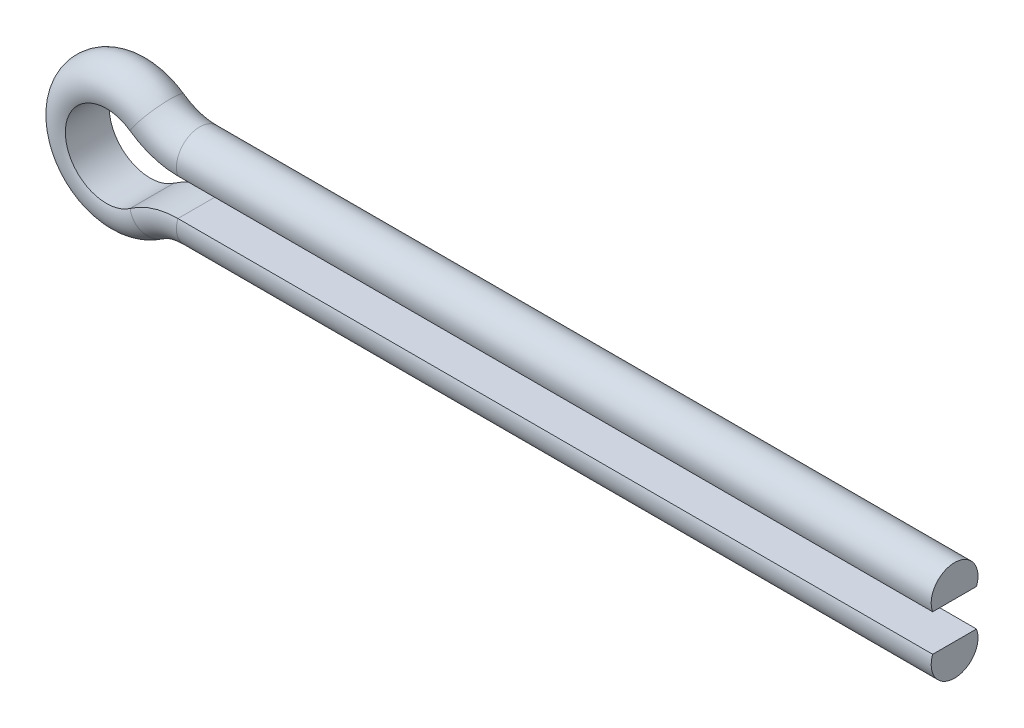
ISO-10303-21;
HEADER;
FILE_DESCRIPTION(('STEP AP214'),'2;1');
FILE_NAME('part.step','',(''),(''),'','','');
FILE_SCHEMA(('AUTOMOTIVE_DESIGN { 1 0 10303 214 1 1 1 1 }'));
ENDSEC;
DATA;
#1=APPLICATION_CONTEXT('core data for automotive mechanical design processes');
#2=APPLICATION_PROTOCOL_DEFINITION('international standard','automotive_design',2000,#1);
#3=PRODUCT_CONTEXT('',#1,'mechanical');
#4=PRODUCT('Part','Part','',(#3));
#5=PRODUCT_RELATED_PRODUCT_CATEGORY('part','',(#4));
#6=PRODUCT_DEFINITION_FORMATION('','',#4);
#7=PRODUCT_DEFINITION_CONTEXT('part definition',#1,'design');
#8=PRODUCT_DEFINITION('design','',#6,#7);
#9=PRODUCT_DEFINITION_SHAPE('','',#8);
#10=(LENGTH_UNIT() NAMED_UNIT(*) SI_UNIT(.MILLI.,.METRE.));
#11=(NAMED_UNIT(*) PLANE_ANGLE_UNIT() SI_UNIT($,.RADIAN.));
#12=(NAMED_UNIT(*) SI_UNIT($,.STERADIAN.) SOLID_ANGLE_UNIT());
#13=UNCERTAINTY_MEASURE_WITH_UNIT(LENGTH_MEASURE(1.E-05),#10,'distance_accuracy_value','');
#14=(GEOMETRIC_REPRESENTATION_CONTEXT(3) GLOBAL_UNCERTAINTY_ASSIGNED_CONTEXT((#13)) GLOBAL_UNIT_ASSIGNED_CONTEXT((#10,
#11,#12)) REPRESENTATION_CONTEXT('',''));
#15=CARTESIAN_POINT('',(0.,0.,0.));
#16=DIRECTION('',(0.,0.,1.));
#17=DIRECTION('',(1.,0.,0.));
#18=AXIS2_PLACEMENT_3D('',#15,#16,#17);
#19=CARTESIAN_POINT('',(100.,-3.22598455954152,0.));
#20=DIRECTION('',(-1.,0.,0.));
#21=DIRECTION('',(0.,-1.,0.));
#22=AXIS2_PLACEMENT_3D('',#19,#20,#21);
#23=PLANE('',#22);
#24=CARTESIAN_POINT('',(100.,-3.22598455954152,0.));
#25=DIRECTION('',(-1.,0.,0.));
#26=DIRECTION('',(0.,-1.,0.));
#27=AXIS2_PLACEMENT_3D('',#24,#25,#26);
#28=CIRCLE('',#27,2.8336817484193);
#29=CARTESIAN_POINT('',(100.,-2.22598455954152,-2.65136799620962));
#30=VERTEX_POINT('',#29);
#31=CARTESIAN_POINT('',(100.,-2.22598455954152,2.65136799620962));
#32=VERTEX_POINT('',#31);
#33=EDGE_CURVE('E79',#30,#32,#28,.T.);
#34=ORIENTED_EDGE('',*,*,#33,.F.);
#35=DIRECTION('',(0.,0.,-1.));
#36=VECTOR('',#35,1.);
#37=CARTESIAN_POINT('',(100.,-2.22598455954152,-2.65136799620962));
#38=LINE('',#37,#36);
#39=EDGE_CURVE('E81',#32,#30,#38,.T.);
#40=ORIENTED_EDGE('',*,*,#39,.F.);
#41=EDGE_LOOP('',(#34,#40));
#42=FACE_BOUND('',#41,.T.);
#43=ADVANCED_FACE('F33',(#42),#23,.F.);
#44=CARTESIAN_POINT('',(100.,3.22598455954152,0.));
#45=DIRECTION('',(1.,0.,0.));
#46=DIRECTION('',(0.,1.,0.));
#47=AXIS2_PLACEMENT_3D('',#44,#45,#46);
#48=PLANE('',#47);
#49=CARTESIAN_POINT('',(100.,3.22598455954152,0.));
#50=DIRECTION('',(1.,0.,0.));
#51=DIRECTION('',(0.,1.,0.));
#52=AXIS2_PLACEMENT_3D('',#49,#50,#51);
#53=CIRCLE('',#52,2.8336817484193);
#54=CARTESIAN_POINT('',(100.,2.22598455954152,-2.65136799620962));
#55=VERTEX_POINT('',#54);
#56=CARTESIAN_POINT('',(100.,2.22598455954152,2.65136799620962));
#57=VERTEX_POINT('',#56);
#58=EDGE_CURVE('E45',#55,#57,#53,.T.);
#59=ORIENTED_EDGE('',*,*,#58,.T.);
#60=DIRECTION('',(0.,0.,-1.));
#61=VECTOR('',#60,1.);
#62=CARTESIAN_POINT('',(100.,2.22598455954152,-2.65136799620962));
#63=LINE('',#62,#61);
#64=EDGE_CURVE('E11',#57,#55,#63,.T.);
#65=ORIENTED_EDGE('',*,*,#64,.T.);
#66=EDGE_LOOP('',(#59,#65));
#67=FACE_BOUND('',#66,.T.);
#68=ADVANCED_FACE('F184',(#67),#48,.T.);
#69=CARTESIAN_POINT('',(100.,-3.22598455954152,0.));
#70=DIRECTION('',(-1.,0.,0.));
#71=DIRECTION('',(0.,-1.,0.));
#72=AXIS2_PLACEMENT_3D('',#69,#70,#71);
#73=CYLINDRICAL_SURFACE('',#72,2.8336817484193);
#74=DIRECTION('',(-1.,0.,0.));
#75=VECTOR('',#74,1.);
#76=CARTESIAN_POINT('',(100.,-2.22598455954152,2.65136799620962));
#77=LINE('',#76,#75);
#78=CARTESIAN_POINT('',(8.65308143228442,-2.22598455954152,2.65136799620962));
#79=VERTEX_POINT('',#78);
#80=EDGE_CURVE('E92',#32,#79,#77,.T.);
#81=ORIENTED_EDGE('',*,*,#80,.T.);
#82=CARTESIAN_POINT('',(8.65308143228442,-3.22598455954152,0.));
#83=DIRECTION('',(-1.,0.,0.));
#84=DIRECTION('',(0.,-1.,0.));
#85=AXIS2_PLACEMENT_3D('',#82,#83,#84);
#86=CIRCLE('',#85,2.8336817484193);
#87=CARTESIAN_POINT('',(8.65308143228442,-2.22598455954153,-2.65136799620962));
#88=VERTEX_POINT('',#87);
#89=EDGE_CURVE('E97',#88,#79,#86,.T.);
#90=ORIENTED_EDGE('',*,*,#89,.F.);
#91=DIRECTION('',(-1.,0.,0.));
#92=VECTOR('',#91,1.);
#93=CARTESIAN_POINT('',(100.,-2.22598455954152,-2.65136799620962));
#94=LINE('',#93,#92);
#95=EDGE_CURVE('E91',#30,#88,#94,.T.);
#96=ORIENTED_EDGE('',*,*,#95,.F.);
#97=ORIENTED_EDGE('',*,*,#33,.T.);
#98=EDGE_LOOP('',(#81,#90,#96,#97));
#99=FACE_BOUND('',#98,.T.);
#100=ADVANCED_FACE('F95',(#99),#73,.T.);
#101=CARTESIAN_POINT('',(100.,-2.22598455954152,-2.65136799620962));
#102=DIRECTION('',(0.,1.,0.));
#103=DIRECTION('',(0.,0.,1.));
#104=AXIS2_PLACEMENT_3D('',#101,#102,#103);
#105=PLANE('',#104);
#106=DIRECTION('',(0.,0.,-1.));
#107=VECTOR('',#106,1.);
#108=CARTESIAN_POINT('',(8.65308143228442,-2.22598455954153,-2.65136799620962));
#109=LINE('',#108,#107);
#110=EDGE_CURVE('E112',#79,#88,#109,.T.);
#111=ORIENTED_EDGE('',*,*,#110,.F.);
#112=ORIENTED_EDGE('',*,*,#80,.F.);
#113=ORIENTED_EDGE('',*,*,#39,.T.);
#114=ORIENTED_EDGE('',*,*,#95,.T.);
#115=EDGE_LOOP('',(#111,#112,#113,#114));
#116=FACE_BOUND('',#115,.T.);
#117=ADVANCED_FACE('F90',(#116),#105,.T.);
#118=CARTESIAN_POINT('',(8.65308143228442,-12.252517362822,0.));
#119=DIRECTION('',(0.,0.,1.));
#120=DIRECTION('',(1.,0.,0.));
#121=AXIS2_PLACEMENT_3D('',#118,#119,#120);
#122=TOROIDAL_SURFACE('',#121,9.02653280328048,2.8336817484193);
#123=CARTESIAN_POINT('',(8.65308143228442,-12.252517362822,2.65136799620962));
#124=DIRECTION('',(0.,0.,1.));
#125=DIRECTION('',(0.,1.,0.));
#126=AXIS2_PLACEMENT_3D('',#123,#124,#125);
#127=CIRCLE('',#126,10.0265328032805);
#128=CARTESIAN_POINT('',(2.86905444360062,-4.06249954541544,2.65136799620962));
#129=VERTEX_POINT('',#128);
#130=EDGE_CURVE('E105',#79,#129,#127,.T.);
#131=ORIENTED_EDGE('',*,*,#130,.T.);
#132=CARTESIAN_POINT('',(3.44592653908625,-4.87933403627024,0.));
#133=DIRECTION('',(-0.8168344908548,-0.576872095485628,0.));
#134=DIRECTION('',(0.576872095485628,-0.8168344908548,0.));
#135=AXIS2_PLACEMENT_3D('',#132,#133,#134);
#136=CIRCLE('',#135,2.8336817484193);
#137=CARTESIAN_POINT('',(2.86905444360062,-4.06249954541544,-2.65136799620962));
#138=VERTEX_POINT('',#137);
#139=EDGE_CURVE('E102',#138,#129,#136,.T.);
#140=ORIENTED_EDGE('',*,*,#139,.F.);
#141=CARTESIAN_POINT('',(8.65308143228442,-12.252517362822,-2.65136799620962));
#142=DIRECTION('',(0.,0.,1.));
#143=DIRECTION('',(0.,1.,0.));
#144=AXIS2_PLACEMENT_3D('',#141,#142,#143);
#145=CIRCLE('',#144,10.0265328032805);
#146=EDGE_CURVE('E106',#88,#138,#145,.T.);
#147=ORIENTED_EDGE('',*,*,#146,.F.);
#148=ORIENTED_EDGE('',*,*,#89,.T.);
#149=EDGE_LOOP('',(#131,#140,#147,#148));
#150=FACE_BOUND('',#149,.T.);
#151=ADVANCED_FACE('F164',(#150),#122,.T.);
#152=CARTESIAN_POINT('',(8.65308143228442,-12.252517362822,0.));
#153=DIRECTION('',(0.,0.,1.));
#154=DIRECTION('',(1.,0.,0.));
#155=AXIS2_PLACEMENT_3D('',#152,#153,#154);
#156=CYLINDRICAL_SURFACE('',#155,10.0265328032805);
#157=DIRECTION('',(0.,0.,-1.));
#158=VECTOR('',#157,1.);
#159=CARTESIAN_POINT('',(2.86905444360062,-4.06249954541544,-2.65136799620962));
#160=LINE('',#159,#158);
#161=EDGE_CURVE('E109',#129,#138,#160,.T.);
#162=ORIENTED_EDGE('',*,*,#161,.F.);
#163=ORIENTED_EDGE('',*,*,#130,.F.);
#164=ORIENTED_EDGE('',*,*,#110,.T.);
#165=ORIENTED_EDGE('',*,*,#146,.T.);
#166=EDGE_LOOP('',(#162,#163,#164,#165));
#167=FACE_BOUND('',#166,.T.);
#168=ADVANCED_FACE('F165',(#167),#156,.T.);
#169=CARTESIAN_POINT('',(0.,0.,0.));
#170=DIRECTION('',(0.,0.,-1.));
#171=DIRECTION('',(-1.,0.,0.));
#172=AXIS2_PLACEMENT_3D('',#169,#170,#171);
#173=TOROIDAL_SURFACE('',#172,5.97346719671953,2.8336817484193);
#174=CARTESIAN_POINT('',(0.,0.,2.65136799620962));
#175=DIRECTION('',(0.,0.,-1.));
#176=DIRECTION('',(0.576872095485628,-0.8168344908548,0.));
#177=AXIS2_PLACEMENT_3D('',#174,#175,#176);
#178=CIRCLE('',#177,4.97346719671953);
#179=CARTESIAN_POINT('',(2.86905444360062,4.06249954541545,2.65136799620962));
#180=VERTEX_POINT('',#179);
#181=EDGE_CURVE('E116',#129,#180,#178,.T.);
#182=ORIENTED_EDGE('',*,*,#181,.T.);
#183=CARTESIAN_POINT('',(3.44592653908625,4.87933403627024,0.));
#184=DIRECTION('',(0.8168344908548,-0.576872095485628,0.));
#185=DIRECTION('',(0.576872095485628,0.8168344908548,0.));
#186=AXIS2_PLACEMENT_3D('',#183,#184,#185);
#187=CIRCLE('',#186,2.8336817484193);
#188=CARTESIAN_POINT('',(2.86905444360062,4.06249954541545,-2.65136799620962));
#189=VERTEX_POINT('',#188);
#190=EDGE_CURVE('E113',#189,#180,#187,.T.);
#191=ORIENTED_EDGE('',*,*,#190,.F.);
#192=CARTESIAN_POINT('',(0.,0.,-2.65136799620962));
#193=DIRECTION('',(0.,0.,-1.));
#194=DIRECTION('',(0.576872095485628,-0.8168344908548,0.));
#195=AXIS2_PLACEMENT_3D('',#192,#193,#194);
#196=CIRCLE('',#195,4.97346719671953);
#197=EDGE_CURVE('E117',#138,#189,#196,.T.);
#198=ORIENTED_EDGE('',*,*,#197,.F.);
#199=ORIENTED_EDGE('',*,*,#139,.T.);
#200=EDGE_LOOP('',(#182,#191,#198,#199));
#201=FACE_BOUND('',#200,.T.);
#202=ADVANCED_FACE('F158',(#201),#173,.T.);
#203=CARTESIAN_POINT('',(0.,0.,0.));
#204=DIRECTION('',(0.,0.,-1.));
#205=DIRECTION('',(-1.,0.,0.));
#206=AXIS2_PLACEMENT_3D('',#203,#204,#205);
#207=CYLINDRICAL_SURFACE('',#206,4.97346719671953);
#208=DIRECTION('',(0.,0.,-1.));
#209=VECTOR('',#208,1.);
#210=CARTESIAN_POINT('',(2.86905444360062,4.06249954541544,-2.65136799620962));
#211=LINE('',#210,#209);
#212=EDGE_CURVE('E120',#180,#189,#211,.T.);
#213=ORIENTED_EDGE('',*,*,#212,.F.);
#214=ORIENTED_EDGE('',*,*,#181,.F.);
#215=ORIENTED_EDGE('',*,*,#161,.T.);
#216=ORIENTED_EDGE('',*,*,#197,.T.);
#217=EDGE_LOOP('',(#213,#214,#215,#216));
#218=FACE_BOUND('',#217,.T.);
#219=ADVANCED_FACE('F159',(#218),#207,.F.);
#220=CARTESIAN_POINT('',(8.65308143228442,12.252517362822,0.));
#221=DIRECTION('',(0.,0.,1.));
#222=DIRECTION('',(1.,0.,0.));
#223=AXIS2_PLACEMENT_3D('',#220,#221,#222);
#224=TOROIDAL_SURFACE('',#223,9.02653280328048,2.8336817484193);
#225=CARTESIAN_POINT('',(8.65308143228442,12.252517362822,2.65136799620962));
#226=DIRECTION('',(0.,0.,1.));
#227=DIRECTION('',(-0.576872095485628,-0.8168344908548,0.));
#228=AXIS2_PLACEMENT_3D('',#225,#226,#227);
#229=CIRCLE('',#228,10.0265328032805);
#230=CARTESIAN_POINT('',(8.65308143228442,2.22598455954153,2.65136799620962));
#231=VERTEX_POINT('',#230);
#232=EDGE_CURVE('E126',#180,#231,#229,.T.);
#233=ORIENTED_EDGE('',*,*,#232,.T.);
#234=CARTESIAN_POINT('',(8.65308143228442,3.22598455954152,0.));
#235=DIRECTION('',(1.,0.,0.));
#236=DIRECTION('',(0.,1.,0.));
#237=AXIS2_PLACEMENT_3D('',#234,#235,#236);
#238=CIRCLE('',#237,2.8336817484193);
#239=CARTESIAN_POINT('',(8.65308143228442,2.22598455954153,-2.65136799620962));
#240=VERTEX_POINT('',#239);
#241=EDGE_CURVE('E123',#240,#231,#238,.T.);
#242=ORIENTED_EDGE('',*,*,#241,.F.);
#243=CARTESIAN_POINT('',(8.65308143228442,12.252517362822,-2.65136799620962));
#244=DIRECTION('',(0.,0.,1.));
#245=DIRECTION('',(-0.576872095485628,-0.8168344908548,0.));
#246=AXIS2_PLACEMENT_3D('',#243,#244,#245);
#247=CIRCLE('',#246,10.0265328032805);
#248=EDGE_CURVE('E127',#189,#240,#247,.T.);
#249=ORIENTED_EDGE('',*,*,#248,.F.);
#250=ORIENTED_EDGE('',*,*,#190,.T.);
#251=EDGE_LOOP('',(#233,#242,#249,#250));
#252=FACE_BOUND('',#251,.T.);
#253=ADVANCED_FACE('F151',(#252),#224,.T.);
#254=CARTESIAN_POINT('',(8.65308143228442,12.252517362822,0.));
#255=DIRECTION('',(0.,0.,1.));
#256=DIRECTION('',(1.,0.,0.));
#257=AXIS2_PLACEMENT_3D('',#254,#255,#256);
#258=CYLINDRICAL_SURFACE('',#257,10.0265328032805);
#259=DIRECTION('',(0.,0.,-1.));
#260=VECTOR('',#259,1.);
#261=CARTESIAN_POINT('',(8.65308143228442,2.22598455954152,-2.65136799620962));
#262=LINE('',#261,#260);
#263=EDGE_CURVE('E130',#231,#240,#262,.T.);
#264=ORIENTED_EDGE('',*,*,#263,.F.);
#265=ORIENTED_EDGE('',*,*,#232,.F.);
#266=ORIENTED_EDGE('',*,*,#212,.T.);
#267=ORIENTED_EDGE('',*,*,#248,.T.);
#268=EDGE_LOOP('',(#264,#265,#266,#267));
#269=FACE_BOUND('',#268,.T.);
#270=ADVANCED_FACE('F153',(#269),#258,.T.);
#271=CARTESIAN_POINT('',(8.65308143228442,3.22598455954152,0.));
#272=DIRECTION('',(1.,0.,0.));
#273=DIRECTION('',(0.,1.,0.));
#274=AXIS2_PLACEMENT_3D('',#271,#272,#273);
#275=CYLINDRICAL_SURFACE('',#274,2.8336817484193);
#276=DIRECTION('',(1.,0.,0.));
#277=VECTOR('',#276,1.);
#278=CARTESIAN_POINT('',(8.65308143228442,2.22598455954152,2.65136799620962));
#279=LINE('',#278,#277);
#280=EDGE_CURVE('E40',#231,#57,#279,.T.);
#281=ORIENTED_EDGE('',*,*,#280,.T.);
#282=ORIENTED_EDGE('',*,*,#58,.F.);
#283=DIRECTION('',(1.,0.,0.));
#284=VECTOR('',#283,1.);
#285=CARTESIAN_POINT('',(8.65308143228442,2.22598455954153,-2.65136799620962));
#286=LINE('',#285,#284);
#287=EDGE_CURVE('E134',#240,#55,#286,.T.);
#288=ORIENTED_EDGE('',*,*,#287,.F.);
#289=ORIENTED_EDGE('',*,*,#241,.T.);
#290=EDGE_LOOP('',(#281,#282,#288,#289));
#291=FACE_BOUND('',#290,.T.);
#292=ADVANCED_FACE('F177',(#291),#275,.T.);
#293=CARTESIAN_POINT('',(8.65308143228442,2.22598455954153,-2.65136799620962));
#294=DIRECTION('',(0.,-1.,0.));
#295=DIRECTION('',(0.,0.,-1.));
#296=AXIS2_PLACEMENT_3D('',#293,#294,#295);
#297=PLANE('',#296);
#298=ORIENTED_EDGE('',*,*,#64,.F.);
#299=ORIENTED_EDGE('',*,*,#280,.F.);
#300=ORIENTED_EDGE('',*,*,#263,.T.);
#301=ORIENTED_EDGE('',*,*,#287,.T.);
#302=EDGE_LOOP('',(#298,#299,#300,#301));
#303=FACE_BOUND('',#302,.T.);
#304=ADVANCED_FACE('F148',(#303),#297,.T.);
#305=CLOSED_SHELL('',(#43,#68,#100,#117,#151,#168,#202,#219,#253,#270,#292,#304));
#306=MANIFOLD_SOLID_BREP('B2',#305);
#307=ADVANCED_BREP_SHAPE_REPRESENTATION('',(#18,#306),#14);
#308=SHAPE_DEFINITION_REPRESENTATION(#9,#307);
ENDSEC;
END-ISO-10303-21;
